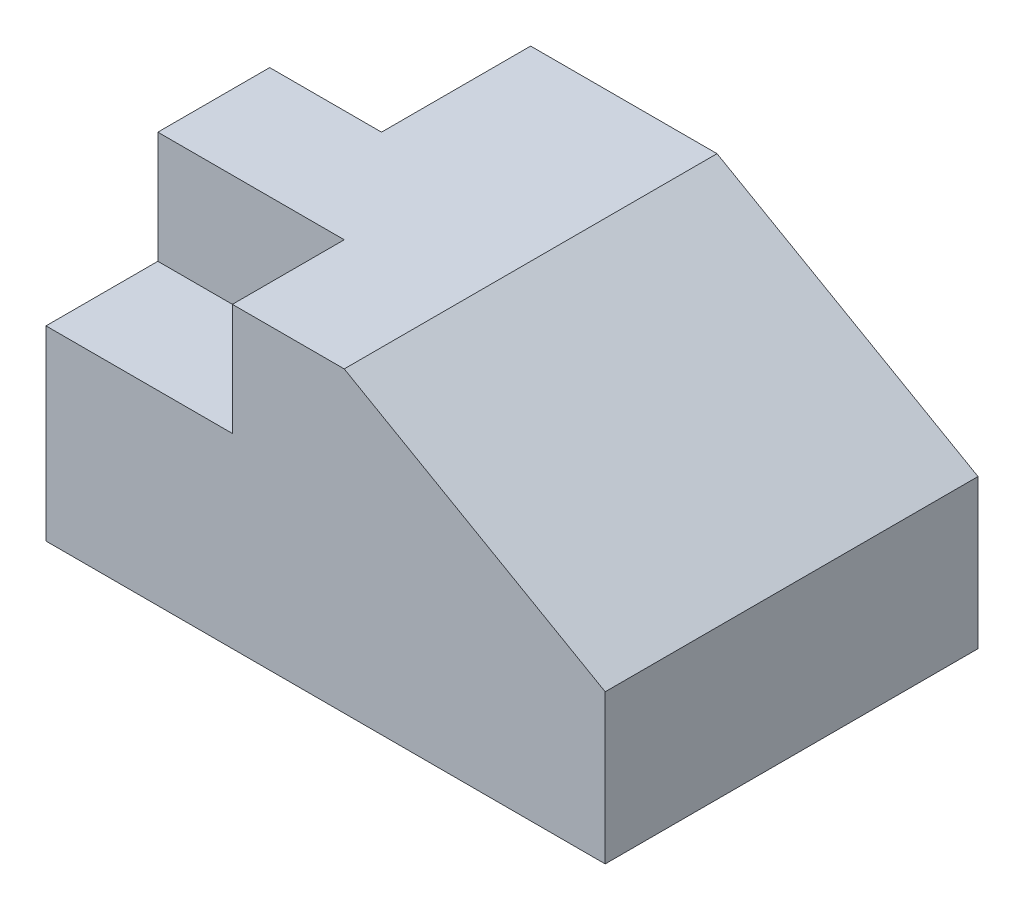
ISO-10303-21;
HEADER;
FILE_DESCRIPTION(('STEP AP214'),'2;1');
FILE_NAME('part.step','',(''),(''),'','','');
FILE_SCHEMA(('AUTOMOTIVE_DESIGN { 1 0 10303 214 1 1 1 1 }'));
ENDSEC;
DATA;
#1=APPLICATION_CONTEXT('core data for automotive mechanical design processes');
#2=APPLICATION_PROTOCOL_DEFINITION('international standard','automotive_design',2000,#1);
#3=PRODUCT_CONTEXT('',#1,'mechanical');
#4=PRODUCT('Part','Part','',(#3));
#5=PRODUCT_RELATED_PRODUCT_CATEGORY('part','',(#4));
#6=PRODUCT_DEFINITION_FORMATION('','',#4);
#7=PRODUCT_DEFINITION_CONTEXT('part definition',#1,'design');
#8=PRODUCT_DEFINITION('design','',#6,#7);
#9=PRODUCT_DEFINITION_SHAPE('','',#8);
#10=(LENGTH_UNIT() NAMED_UNIT(*) SI_UNIT(.MILLI.,.METRE.));
#11=(NAMED_UNIT(*) PLANE_ANGLE_UNIT() SI_UNIT($,.RADIAN.));
#12=(NAMED_UNIT(*) SI_UNIT($,.STERADIAN.) SOLID_ANGLE_UNIT());
#13=UNCERTAINTY_MEASURE_WITH_UNIT(LENGTH_MEASURE(1.E-05),#10,'distance_accuracy_value','');
#14=(GEOMETRIC_REPRESENTATION_CONTEXT(3) GLOBAL_UNCERTAINTY_ASSIGNED_CONTEXT((#13)) GLOBAL_UNIT_ASSIGNED_CONTEXT((#10,
#11,#12)) REPRESENTATION_CONTEXT('',''));
#15=CARTESIAN_POINT('',(0.,0.,0.));
#16=DIRECTION('',(0.,0.,1.));
#17=DIRECTION('',(1.,0.,0.));
#18=AXIS2_PLACEMENT_3D('',#15,#16,#17);
#19=CARTESIAN_POINT('',(0.,0.,-100.));
#20=DIRECTION('',(0.,-1.,0.));
#21=DIRECTION('',(0.,0.,-1.));
#22=AXIS2_PLACEMENT_3D('',#19,#20,#21);
#23=PLANE('',#22);
#24=DIRECTION('',(1.,0.,0.));
#25=VECTOR('',#24,1.);
#26=CARTESIAN_POINT('',(0.,0.,-60.));
#27=LINE('',#26,#25);
#28=CARTESIAN_POINT('',(0.,0.,-60.));
#29=VERTEX_POINT('',#28);
#30=CARTESIAN_POINT('',(30.,0.,-60.));
#31=VERTEX_POINT('',#30);
#32=EDGE_CURVE('E117',#29,#31,#27,.T.);
#33=ORIENTED_EDGE('',*,*,#32,.T.);
#34=DIRECTION('',(0.,0.,-1.));
#35=VECTOR('',#34,1.);
#36=CARTESIAN_POINT('',(30.,0.,-100.));
#37=LINE('',#36,#35);
#38=CARTESIAN_POINT('',(30.,0.,-100.));
#39=VERTEX_POINT('',#38);
#40=EDGE_CURVE('E129',#31,#39,#37,.T.);
#41=ORIENTED_EDGE('',*,*,#40,.T.);
#42=DIRECTION('',(1.,0.,0.));
#43=VECTOR('',#42,1.);
#44=CARTESIAN_POINT('',(0.,0.,-100.));
#45=LINE('',#44,#43);
#46=CARTESIAN_POINT('',(150.,0.,-100.));
#47=VERTEX_POINT('',#46);
#48=EDGE_CURVE('E147',#39,#47,#45,.T.);
#49=ORIENTED_EDGE('',*,*,#48,.T.);
#50=DIRECTION('',(0.,0.,1.));
#51=VECTOR('',#50,1.);
#52=CARTESIAN_POINT('',(150.,0.,-100.));
#53=LINE('',#52,#51);
#54=CARTESIAN_POINT('',(150.,0.,0.));
#55=VERTEX_POINT('',#54);
#56=EDGE_CURVE('E11',#47,#55,#53,.T.);
#57=ORIENTED_EDGE('',*,*,#56,.T.);
#58=DIRECTION('',(1.,0.,0.));
#59=VECTOR('',#58,1.);
#60=CARTESIAN_POINT('',(0.,0.,0.));
#61=LINE('',#60,#59);
#62=CARTESIAN_POINT('',(0.,0.,0.));
#63=VERTEX_POINT('',#62);
#64=EDGE_CURVE('E143',#63,#55,#61,.T.);
#65=ORIENTED_EDGE('',*,*,#64,.F.);
#66=DIRECTION('',(0.,0.,1.));
#67=VECTOR('',#66,1.);
#68=CARTESIAN_POINT('',(0.,0.,-100.));
#69=LINE('',#68,#67);
#70=EDGE_CURVE('E49',#29,#63,#69,.T.);
#71=ORIENTED_EDGE('',*,*,#70,.F.);
#72=EDGE_LOOP('',(#33,#41,#49,#57,#65,#71));
#73=FACE_BOUND('',#72,.T.);
#74=ADVANCED_FACE('F41',(#73),#23,.T.);
#75=CARTESIAN_POINT('',(80.,80.,-100.));
#76=DIRECTION('',(0.,1.,0.));
#77=DIRECTION('',(-1.,0.,0.));
#78=AXIS2_PLACEMENT_3D('',#75,#76,#77);
#79=PLANE('',#78);
#80=DIRECTION('',(1.,0.,0.));
#81=VECTOR('',#80,1.);
#82=CARTESIAN_POINT('',(0.,80.,-60.));
#83=LINE('',#82,#81);
#84=CARTESIAN_POINT('',(0.,80.,-60.));
#85=VERTEX_POINT('',#84);
#86=CARTESIAN_POINT('',(30.,80.,-60.));
#87=VERTEX_POINT('',#86);
#88=EDGE_CURVE('E204',#85,#87,#83,.T.);
#89=ORIENTED_EDGE('',*,*,#88,.F.);
#90=DIRECTION('',(0.,0.,1.));
#91=VECTOR('',#90,1.);
#92=CARTESIAN_POINT('',(0.,80.,-100.));
#93=LINE('',#92,#91);
#94=CARTESIAN_POINT('',(0.,80.,-30.));
#95=VERTEX_POINT('',#94);
#96=EDGE_CURVE('E140',#85,#95,#93,.T.);
#97=ORIENTED_EDGE('',*,*,#96,.T.);
#98=DIRECTION('',(-1.,0.,0.));
#99=VECTOR('',#98,1.);
#100=CARTESIAN_POINT('',(0.,80.,-30.));
#101=LINE('',#100,#99);
#102=CARTESIAN_POINT('',(50.,80.,-30.));
#103=VERTEX_POINT('',#102);
#104=EDGE_CURVE('E185',#103,#95,#101,.T.);
#105=ORIENTED_EDGE('',*,*,#104,.F.);
#106=DIRECTION('',(0.,0.,1.));
#107=VECTOR('',#106,1.);
#108=CARTESIAN_POINT('',(50.,80.,-30.));
#109=LINE('',#108,#107);
#110=CARTESIAN_POINT('',(50.,80.,0.));
#111=VERTEX_POINT('',#110);
#112=EDGE_CURVE('E170',#103,#111,#109,.T.);
#113=ORIENTED_EDGE('',*,*,#112,.T.);
#114=DIRECTION('',(-1.,0.,0.));
#115=VECTOR('',#114,1.);
#116=CARTESIAN_POINT('',(80.,80.,0.));
#117=LINE('',#116,#115);
#118=CARTESIAN_POINT('',(80.,80.,0.));
#119=VERTEX_POINT('',#118);
#120=EDGE_CURVE('E168',#119,#111,#117,.T.);
#121=ORIENTED_EDGE('',*,*,#120,.F.);
#122=DIRECTION('',(0.,0.,1.));
#123=VECTOR('',#122,1.);
#124=CARTESIAN_POINT('',(80.,80.,-100.));
#125=LINE('',#124,#123);
#126=CARTESIAN_POINT('',(80.,80.,-100.));
#127=VERTEX_POINT('',#126);
#128=EDGE_CURVE('E141',#127,#119,#125,.T.);
#129=ORIENTED_EDGE('',*,*,#128,.F.);
#130=DIRECTION('',(-1.,0.,0.));
#131=VECTOR('',#130,1.);
#132=CARTESIAN_POINT('',(80.,80.,-100.));
#133=LINE('',#132,#131);
#134=CARTESIAN_POINT('',(30.,80.,-100.));
#135=VERTEX_POINT('',#134);
#136=EDGE_CURVE('E152',#127,#135,#133,.T.);
#137=ORIENTED_EDGE('',*,*,#136,.T.);
#138=DIRECTION('',(0.,0.,-1.));
#139=VECTOR('',#138,1.);
#140=CARTESIAN_POINT('',(30.,80.,-100.));
#141=LINE('',#140,#139);
#142=EDGE_CURVE('E59',#87,#135,#141,.T.);
#143=ORIENTED_EDGE('',*,*,#142,.F.);
#144=EDGE_LOOP('',(#89,#97,#105,#113,#121,#129,#137,#143));
#145=FACE_BOUND('',#144,.T.);
#146=ADVANCED_FACE('F213',(#145),#79,.T.);
#147=CARTESIAN_POINT('',(150.,0.,-100.));
#148=DIRECTION('',(1.,0.,0.));
#149=DIRECTION('',(0.,0.,-1.));
#150=AXIS2_PLACEMENT_3D('',#147,#148,#149);
#151=PLANE('',#150);
#152=DIRECTION('',(0.,1.,0.));
#153=VECTOR('',#152,1.);
#154=CARTESIAN_POINT('',(150.,0.,0.));
#155=LINE('',#154,#153);
#156=CARTESIAN_POINT('',(150.,40.,0.));
#157=VERTEX_POINT('',#156);
#158=EDGE_CURVE('E162',#55,#157,#155,.T.);
#159=ORIENTED_EDGE('',*,*,#158,.F.);
#160=ORIENTED_EDGE('',*,*,#56,.F.);
#161=DIRECTION('',(0.,1.,0.));
#162=VECTOR('',#161,1.);
#163=CARTESIAN_POINT('',(150.,0.,-100.));
#164=LINE('',#163,#162);
#165=CARTESIAN_POINT('',(150.,40.,-100.));
#166=VERTEX_POINT('',#165);
#167=EDGE_CURVE('E173',#47,#166,#164,.T.);
#168=ORIENTED_EDGE('',*,*,#167,.T.);
#169=DIRECTION('',(0.,0.,1.));
#170=VECTOR('',#169,1.);
#171=CARTESIAN_POINT('',(150.,40.,-100.));
#172=LINE('',#171,#170);
#173=EDGE_CURVE('E44',#166,#157,#172,.T.);
#174=ORIENTED_EDGE('',*,*,#173,.T.);
#175=EDGE_LOOP('',(#159,#160,#168,#174));
#176=FACE_BOUND('',#175,.T.);
#177=ADVANCED_FACE('F43',(#176),#151,.T.);
#178=CARTESIAN_POINT('',(0.,80.,-100.));
#179=DIRECTION('',(-1.,0.,0.));
#180=DIRECTION('',(0.,-1.,0.));
#181=AXIS2_PLACEMENT_3D('',#178,#179,#180);
#182=PLANE('',#181);
#183=DIRECTION('',(0.,1.,0.));
#184=VECTOR('',#183,1.);
#185=CARTESIAN_POINT('',(0.,0.,-60.));
#186=LINE('',#185,#184);
#187=EDGE_CURVE('E125',#29,#85,#186,.T.);
#188=ORIENTED_EDGE('',*,*,#187,.F.);
#189=ORIENTED_EDGE('',*,*,#70,.T.);
#190=DIRECTION('',(0.,-1.,0.));
#191=VECTOR('',#190,1.);
#192=CARTESIAN_POINT('',(0.,80.,0.));
#193=LINE('',#192,#191);
#194=CARTESIAN_POINT('',(0.,50.,0.));
#195=VERTEX_POINT('',#194);
#196=EDGE_CURVE('E172',#195,#63,#193,.T.);
#197=ORIENTED_EDGE('',*,*,#196,.F.);
#198=DIRECTION('',(0.,0.,1.));
#199=VECTOR('',#198,1.);
#200=CARTESIAN_POINT('',(0.,50.,-30.));
#201=LINE('',#200,#199);
#202=CARTESIAN_POINT('',(0.,50.,-30.));
#203=VERTEX_POINT('',#202);
#204=EDGE_CURVE('E176',#203,#195,#201,.T.);
#205=ORIENTED_EDGE('',*,*,#204,.F.);
#206=DIRECTION('',(0.,-1.,0.));
#207=VECTOR('',#206,1.);
#208=CARTESIAN_POINT('',(0.,80.,-30.));
#209=LINE('',#208,#207);
#210=EDGE_CURVE('E187',#95,#203,#209,.T.);
#211=ORIENTED_EDGE('',*,*,#210,.F.);
#212=ORIENTED_EDGE('',*,*,#96,.F.);
#213=EDGE_LOOP('',(#188,#189,#197,#205,#211,#212));
#214=FACE_BOUND('',#213,.T.);
#215=ADVANCED_FACE('F132',(#214),#182,.T.);
#216=CARTESIAN_POINT('',(150.,40.,-100.));
#217=DIRECTION('',(0.496138938356834,0.868243142124459,0.));
#218=DIRECTION('',(-0.868243142124459,0.496138938356834,0.));
#219=AXIS2_PLACEMENT_3D('',#216,#217,#218);
#220=PLANE('',#219);
#221=DIRECTION('',(-0.868243142124459,0.496138938356834,0.));
#222=VECTOR('',#221,1.);
#223=CARTESIAN_POINT('',(150.,40.,0.));
#224=LINE('',#223,#222);
#225=EDGE_CURVE('E167',#157,#119,#224,.T.);
#226=ORIENTED_EDGE('',*,*,#225,.F.);
#227=ORIENTED_EDGE('',*,*,#173,.F.);
#228=DIRECTION('',(-0.868243142124459,0.496138938356834,0.));
#229=VECTOR('',#228,1.);
#230=CARTESIAN_POINT('',(150.,40.,-100.));
#231=LINE('',#230,#229);
#232=EDGE_CURVE('E157',#166,#127,#231,.T.);
#233=ORIENTED_EDGE('',*,*,#232,.T.);
#234=ORIENTED_EDGE('',*,*,#128,.T.);
#235=EDGE_LOOP('',(#226,#227,#233,#234));
#236=FACE_BOUND('',#235,.T.);
#237=ADVANCED_FACE('F209',(#236),#220,.T.);
#238=CARTESIAN_POINT('',(0.,0.,-100.));
#239=DIRECTION('',(0.,0.,1.));
#240=DIRECTION('',(1.,0.,0.));
#241=AXIS2_PLACEMENT_3D('',#238,#239,#240);
#242=PLANE('',#241);
#243=ORIENTED_EDGE('',*,*,#48,.F.);
#244=DIRECTION('',(0.,1.,0.));
#245=VECTOR('',#244,1.);
#246=CARTESIAN_POINT('',(30.,0.,-100.));
#247=LINE('',#246,#245);
#248=EDGE_CURVE('E189',#39,#135,#247,.T.);
#249=ORIENTED_EDGE('',*,*,#248,.T.);
#250=ORIENTED_EDGE('',*,*,#136,.F.);
#251=ORIENTED_EDGE('',*,*,#232,.F.);
#252=ORIENTED_EDGE('',*,*,#167,.F.);
#253=EDGE_LOOP('',(#243,#249,#250,#251,#252));
#254=FACE_BOUND('',#253,.T.);
#255=ADVANCED_FACE('F210',(#254),#242,.F.);
#256=CARTESIAN_POINT('',(0.,0.,0.));
#257=DIRECTION('',(0.,0.,1.));
#258=DIRECTION('',(1.,0.,0.));
#259=AXIS2_PLACEMENT_3D('',#256,#257,#258);
#260=PLANE('',#259);
#261=DIRECTION('',(1.,0.,0.));
#262=VECTOR('',#261,1.);
#263=CARTESIAN_POINT('',(0.,50.,0.));
#264=LINE('',#263,#262);
#265=CARTESIAN_POINT('',(50.,50.,0.));
#266=VERTEX_POINT('',#265);
#267=EDGE_CURVE('E67',#195,#266,#264,.T.);
#268=ORIENTED_EDGE('',*,*,#267,.F.);
#269=ORIENTED_EDGE('',*,*,#196,.T.);
#270=ORIENTED_EDGE('',*,*,#64,.T.);
#271=ORIENTED_EDGE('',*,*,#158,.T.);
#272=ORIENTED_EDGE('',*,*,#225,.T.);
#273=ORIENTED_EDGE('',*,*,#120,.T.);
#274=DIRECTION('',(0.,1.,0.));
#275=VECTOR('',#274,1.);
#276=CARTESIAN_POINT('',(50.,80.,0.));
#277=LINE('',#276,#275);
#278=EDGE_CURVE('E186',#266,#111,#277,.T.);
#279=ORIENTED_EDGE('',*,*,#278,.F.);
#280=EDGE_LOOP('',(#268,#269,#270,#271,#272,#273,#279));
#281=FACE_BOUND('',#280,.T.);
#282=ADVANCED_FACE('F211',(#281),#260,.T.);
#283=CARTESIAN_POINT('',(50.,80.,-30.));
#284=DIRECTION('',(1.,0.,0.));
#285=DIRECTION('',(0.,0.,-1.));
#286=AXIS2_PLACEMENT_3D('',#283,#284,#285);
#287=PLANE('',#286);
#288=ORIENTED_EDGE('',*,*,#278,.T.);
#289=ORIENTED_EDGE('',*,*,#112,.F.);
#290=DIRECTION('',(0.,1.,0.));
#291=VECTOR('',#290,1.);
#292=CARTESIAN_POINT('',(50.,80.,-30.));
#293=LINE('',#292,#291);
#294=CARTESIAN_POINT('',(50.,50.,-30.));
#295=VERTEX_POINT('',#294);
#296=EDGE_CURVE('E194',#295,#103,#293,.T.);
#297=ORIENTED_EDGE('',*,*,#296,.F.);
#298=DIRECTION('',(0.,0.,1.));
#299=VECTOR('',#298,1.);
#300=CARTESIAN_POINT('',(50.,50.,-30.));
#301=LINE('',#300,#299);
#302=EDGE_CURVE('E182',#295,#266,#301,.T.);
#303=ORIENTED_EDGE('',*,*,#302,.T.);
#304=EDGE_LOOP('',(#288,#289,#297,#303));
#305=FACE_BOUND('',#304,.T.);
#306=ADVANCED_FACE('F237',(#305),#287,.F.);
#307=CARTESIAN_POINT('',(0.,50.,-30.));
#308=DIRECTION('',(0.,-1.,0.));
#309=DIRECTION('',(0.,0.,-1.));
#310=AXIS2_PLACEMENT_3D('',#307,#308,#309);
#311=PLANE('',#310);
#312=ORIENTED_EDGE('',*,*,#267,.T.);
#313=ORIENTED_EDGE('',*,*,#302,.F.);
#314=DIRECTION('',(1.,0.,0.));
#315=VECTOR('',#314,1.);
#316=CARTESIAN_POINT('',(0.,50.,-30.));
#317=LINE('',#316,#315);
#318=EDGE_CURVE('E198',#203,#295,#317,.T.);
#319=ORIENTED_EDGE('',*,*,#318,.F.);
#320=ORIENTED_EDGE('',*,*,#204,.T.);
#321=EDGE_LOOP('',(#312,#313,#319,#320));
#322=FACE_BOUND('',#321,.T.);
#323=ADVANCED_FACE('F236',(#322),#311,.F.);
#324=CARTESIAN_POINT('',(0.,0.,-30.));
#325=DIRECTION('',(0.,0.,1.));
#326=DIRECTION('',(1.,0.,0.));
#327=AXIS2_PLACEMENT_3D('',#324,#325,#326);
#328=PLANE('',#327);
#329=ORIENTED_EDGE('',*,*,#210,.T.);
#330=ORIENTED_EDGE('',*,*,#318,.T.);
#331=ORIENTED_EDGE('',*,*,#296,.T.);
#332=ORIENTED_EDGE('',*,*,#104,.T.);
#333=EDGE_LOOP('',(#329,#330,#331,#332));
#334=FACE_BOUND('',#333,.T.);
#335=ADVANCED_FACE('F241',(#334),#328,.T.);
#336=CARTESIAN_POINT('',(30.,0.,-100.));
#337=DIRECTION('',(1.,0.,0.));
#338=DIRECTION('',(0.,0.,-1.));
#339=AXIS2_PLACEMENT_3D('',#336,#337,#338);
#340=PLANE('',#339);
#341=ORIENTED_EDGE('',*,*,#142,.T.);
#342=ORIENTED_EDGE('',*,*,#248,.F.);
#343=ORIENTED_EDGE('',*,*,#40,.F.);
#344=DIRECTION('',(0.,1.,0.));
#345=VECTOR('',#344,1.);
#346=CARTESIAN_POINT('',(30.,0.,-60.));
#347=LINE('',#346,#345);
#348=EDGE_CURVE('E121',#31,#87,#347,.T.);
#349=ORIENTED_EDGE('',*,*,#348,.T.);
#350=EDGE_LOOP('',(#341,#342,#343,#349));
#351=FACE_BOUND('',#350,.T.);
#352=ADVANCED_FACE('F247',(#351),#340,.F.);
#353=CARTESIAN_POINT('',(0.,0.,-60.));
#354=DIRECTION('',(0.,0.,1.));
#355=DIRECTION('',(1.,0.,0.));
#356=AXIS2_PLACEMENT_3D('',#353,#354,#355);
#357=PLANE('',#356);
#358=ORIENTED_EDGE('',*,*,#88,.T.);
#359=ORIENTED_EDGE('',*,*,#348,.F.);
#360=ORIENTED_EDGE('',*,*,#32,.F.);
#361=ORIENTED_EDGE('',*,*,#187,.T.);
#362=EDGE_LOOP('',(#358,#359,#360,#361));
#363=FACE_BOUND('',#362,.T.);
#364=ADVANCED_FACE('F122',(#363),#357,.F.);
#365=CLOSED_SHELL('',(#74,#146,#177,#215,#237,#255,#282,#306,#323,#335,#352,#364));
#366=MANIFOLD_SOLID_BREP('B2',#365);
#367=ADVANCED_BREP_SHAPE_REPRESENTATION('',(#18,#366),#14);
#368=SHAPE_DEFINITION_REPRESENTATION(#9,#367);
ENDSEC;
END-ISO-10303-21;
